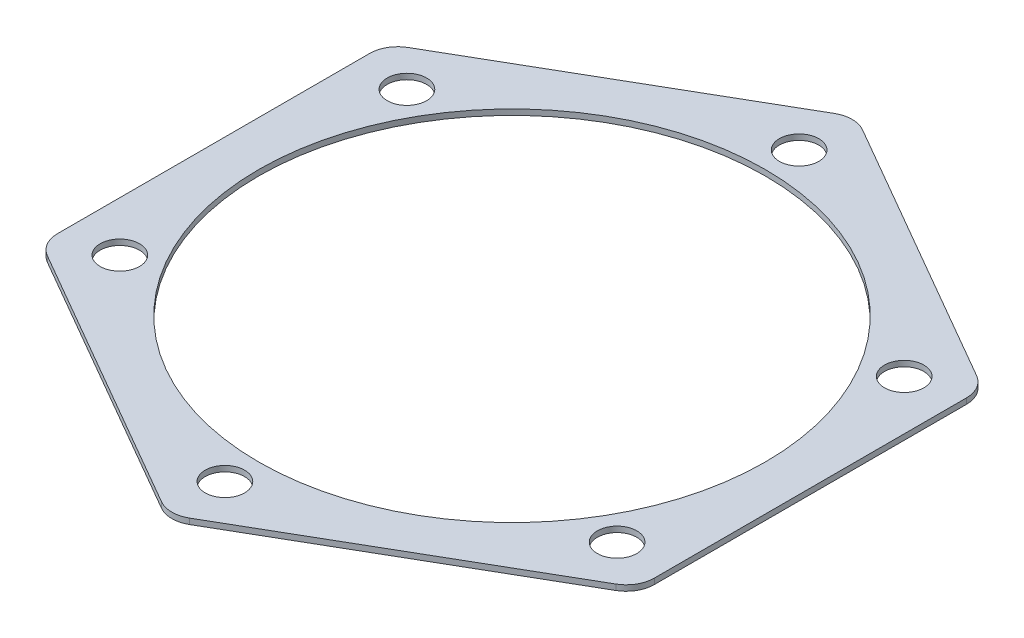
ISO-10303-21;
HEADER;
FILE_DESCRIPTION(('STEP AP214'),'2;1');
FILE_NAME('part.step','',(''),(''),'','','');
FILE_SCHEMA(('AUTOMOTIVE_DESIGN { 1 0 10303 214 1 1 1 1 }'));
ENDSEC;
DATA;
#1=APPLICATION_CONTEXT('core data for automotive mechanical design processes');
#2=APPLICATION_PROTOCOL_DEFINITION('international standard','automotive_design',2000,#1);
#3=PRODUCT_CONTEXT('',#1,'mechanical');
#4=PRODUCT('Part','Part','',(#3));
#5=PRODUCT_RELATED_PRODUCT_CATEGORY('part','',(#4));
#6=PRODUCT_DEFINITION_FORMATION('','',#4);
#7=PRODUCT_DEFINITION_CONTEXT('part definition',#1,'design');
#8=PRODUCT_DEFINITION('design','',#6,#7);
#9=PRODUCT_DEFINITION_SHAPE('','',#8);
#10=(LENGTH_UNIT() NAMED_UNIT(*) SI_UNIT(.MILLI.,.METRE.));
#11=(NAMED_UNIT(*) PLANE_ANGLE_UNIT() SI_UNIT($,.RADIAN.));
#12=(NAMED_UNIT(*) SI_UNIT($,.STERADIAN.) SOLID_ANGLE_UNIT());
#13=UNCERTAINTY_MEASURE_WITH_UNIT(LENGTH_MEASURE(1.E-05),#10,'distance_accuracy_value','');
#14=(GEOMETRIC_REPRESENTATION_CONTEXT(3) GLOBAL_UNCERTAINTY_ASSIGNED_CONTEXT((#13)) GLOBAL_UNIT_ASSIGNED_CONTEXT((#10,
#11,#12)) REPRESENTATION_CONTEXT('',''));
#15=CARTESIAN_POINT('',(0.,0.,0.));
#16=DIRECTION('',(0.,0.,1.));
#17=DIRECTION('',(1.,0.,0.));
#18=AXIS2_PLACEMENT_3D('',#15,#16,#17);
#19=CARTESIAN_POINT('',(-48.0000000000003,1.,-27.7128129211016));
#20=DIRECTION('',(0.,1.,0.));
#21=DIRECTION('',(0.,0.,1.));
#22=AXIS2_PLACEMENT_3D('',#19,#20,#21);
#23=PLANE('',#22);
#24=CARTESIAN_POINT('',(-44.1672955930031,1.,25.5000000000019));
#25=DIRECTION('',(0.,1.,0.));
#26=DIRECTION('',(0.,0.,1.));
#27=AXIS2_PLACEMENT_3D('',#24,#25,#26);
#28=CIRCLE('',#27,3.50000000000413);
#29=CARTESIAN_POINT('',(-44.1672955930031,1.,29.000000000006));
#30=VERTEX_POINT('',#29);
#31=EDGE_CURVE('E303',#30,#30,#28,.T.);
#32=ORIENTED_EDGE('',*,*,#31,.F.);
#33=EDGE_LOOP('',(#32));
#34=FACE_BOUND('',#33,.T.);
#35=CARTESIAN_POINT('',(44.1672955930096,1.,25.4999999999981));
#36=DIRECTION('',(0.,1.,0.));
#37=DIRECTION('',(0.,0.,1.));
#38=AXIS2_PLACEMENT_3D('',#35,#36,#37);
#39=CIRCLE('',#38,3.50000000000279);
#40=CARTESIAN_POINT('',(44.1672955930096,1.,29.0000000000009));
#41=VERTEX_POINT('',#40);
#42=EDGE_CURVE('E315',#41,#41,#39,.T.);
#43=ORIENTED_EDGE('',*,*,#42,.F.);
#44=EDGE_LOOP('',(#43));
#45=FACE_BOUND('',#44,.T.);
#46=CARTESIAN_POINT('',(0.,1.,-51.));
#47=DIRECTION('',(0.,1.,0.));
#48=DIRECTION('',(0.,0.,1.));
#49=AXIS2_PLACEMENT_3D('',#46,#47,#48);
#50=CIRCLE('',#49,3.5);
#51=CARTESIAN_POINT('',(0.,1.,-47.5));
#52=VERTEX_POINT('',#51);
#53=EDGE_CURVE('E327',#52,#52,#50,.T.);
#54=ORIENTED_EDGE('',*,*,#53,.F.);
#55=EDGE_LOOP('',(#54));
#56=FACE_BOUND('',#55,.T.);
#57=CARTESIAN_POINT('',(-48.0000000000003,1.,-27.7128129211016));
#58=DIRECTION('',(0.,1.,0.));
#59=DIRECTION('',(0.,0.,1.));
#60=AXIS2_PLACEMENT_3D('',#57,#58,#59);
#61=CIRCLE('',#60,5.);
#62=CARTESIAN_POINT('',(-50.5000000000003,1.,-32.0429399400238));
#63=VERTEX_POINT('',#62);
#64=CARTESIAN_POINT('',(-53.0000000000003,1.,-27.7128129211015));
#65=VERTEX_POINT('',#64);
#66=EDGE_CURVE('E177',#63,#65,#61,.T.);
#67=ORIENTED_EDGE('',*,*,#66,.T.);
#68=DIRECTION('',(0.,0.,1.));
#69=VECTOR('',#68,1.);
#70=CARTESIAN_POINT('',(-53.0000000000003,1.,-27.7128129211015));
#71=LINE('',#70,#69);
#72=CARTESIAN_POINT('',(-52.9999999999997,1.,27.7128129211027));
#73=VERTEX_POINT('',#72);
#74=EDGE_CURVE('E105',#65,#73,#71,.T.);
#75=ORIENTED_EDGE('',*,*,#74,.T.);
#76=CARTESIAN_POINT('',(-47.9999999999997,1.,27.7128129211026));
#77=DIRECTION('',(0.,1.,0.));
#78=DIRECTION('',(0.,0.,1.));
#79=AXIS2_PLACEMENT_3D('',#76,#77,#78);
#80=CIRCLE('',#79,5.);
#81=CARTESIAN_POINT('',(-50.4999999999997,1.,32.0429399400249));
#82=VERTEX_POINT('',#81);
#83=EDGE_CURVE('E204',#73,#82,#80,.T.);
#84=ORIENTED_EDGE('',*,*,#83,.T.);
#85=DIRECTION('',(0.866025403784442,0.,0.499999999999995));
#86=VECTOR('',#85,1.);
#87=CARTESIAN_POINT('',(-50.4999999999997,1.,32.0429399400249));
#88=LINE('',#87,#86);
#89=CARTESIAN_POINT('',(-2.50000000000002,1.,59.7557528611263));
#90=VERTEX_POINT('',#89);
#91=EDGE_CURVE('E223',#82,#90,#88,.T.);
#92=ORIENTED_EDGE('',*,*,#91,.T.);
#93=CARTESIAN_POINT('',(0.,1.,55.4256258422041));
#94=DIRECTION('',(0.,1.,0.));
#95=DIRECTION('',(0.,0.,-1.));
#96=AXIS2_PLACEMENT_3D('',#93,#94,#95);
#97=CIRCLE('',#96,5.);
#98=CARTESIAN_POINT('',(2.5,1.,59.7557528611263));
#99=VERTEX_POINT('',#98);
#100=EDGE_CURVE('E220',#90,#99,#97,.T.);
#101=ORIENTED_EDGE('',*,*,#100,.T.);
#102=DIRECTION('',(0.866025403784438,0.,-0.500000000000001));
#103=VECTOR('',#102,1.);
#104=CARTESIAN_POINT('',(2.5,1.,59.7557528611263));
#105=LINE('',#104,#103);
#106=CARTESIAN_POINT('',(50.5000000000001,1.,32.0429399400241));
#107=VERTEX_POINT('',#106);
#108=EDGE_CURVE('E222',#99,#107,#105,.T.);
#109=ORIENTED_EDGE('',*,*,#108,.T.);
#110=CARTESIAN_POINT('',(48.0000000000001,1.,27.7128129211019));
#111=DIRECTION('',(0.,1.,0.));
#112=DIRECTION('',(0.,0.,1.));
#113=AXIS2_PLACEMENT_3D('',#110,#111,#112);
#114=CIRCLE('',#113,5.);
#115=CARTESIAN_POINT('',(53.0000000000001,1.,27.7128129211019));
#116=VERTEX_POINT('',#115);
#117=EDGE_CURVE('E225',#107,#116,#114,.T.);
#118=ORIENTED_EDGE('',*,*,#117,.T.);
#119=DIRECTION('',(0.,0.,-1.));
#120=VECTOR('',#119,1.);
#121=CARTESIAN_POINT('',(53.0000000000001,1.,27.7128129211019));
#122=LINE('',#121,#120);
#123=CARTESIAN_POINT('',(52.9999999999999,1.,-27.7128129211023));
#124=VERTEX_POINT('',#123);
#125=EDGE_CURVE('E231',#116,#124,#122,.T.);
#126=ORIENTED_EDGE('',*,*,#125,.T.);
#127=CARTESIAN_POINT('',(47.9999999999999,1.,-27.7128129211023));
#128=DIRECTION('',(0.,1.,0.));
#129=DIRECTION('',(0.,0.,1.));
#130=AXIS2_PLACEMENT_3D('',#127,#128,#129);
#131=CIRCLE('',#130,5.);
#132=CARTESIAN_POINT('',(50.4999999999999,1.,-32.0429399400245));
#133=VERTEX_POINT('',#132);
#134=EDGE_CURVE('E136',#124,#133,#131,.T.);
#135=ORIENTED_EDGE('',*,*,#134,.T.);
#136=DIRECTION('',(-0.866025403784441,0.,-0.499999999999995));
#137=VECTOR('',#136,1.);
#138=CARTESIAN_POINT('',(50.4999999999999,1.,-32.0429399400245));
#139=LINE('',#138,#137);
#140=CARTESIAN_POINT('',(2.49999999999961,1.,-59.7557528611263));
#141=VERTEX_POINT('',#140);
#142=EDGE_CURVE('E130',#133,#141,#139,.T.);
#143=ORIENTED_EDGE('',*,*,#142,.T.);
#144=CARTESIAN_POINT('',(-3.87610001608621E-13,1.,-55.4256258422041));
#145=DIRECTION('',(0.,1.,0.));
#146=DIRECTION('',(0.,0.,1.));
#147=AXIS2_PLACEMENT_3D('',#144,#145,#146);
#148=CIRCLE('',#147,5.);
#149=CARTESIAN_POINT('',(-2.50000000000044,1.,-59.7557528611263));
#150=VERTEX_POINT('',#149);
#151=EDGE_CURVE('E134',#141,#150,#148,.T.);
#152=ORIENTED_EDGE('',*,*,#151,.T.);
#153=DIRECTION('',(-0.866025403784435,0.,0.500000000000007));
#154=VECTOR('',#153,1.);
#155=CARTESIAN_POINT('',(-2.50000000000044,1.,-59.7557528611263));
#156=LINE('',#155,#154);
#157=EDGE_CURVE('E50',#150,#63,#156,.T.);
#158=ORIENTED_EDGE('',*,*,#157,.T.);
#159=EDGE_LOOP('',(#67,#75,#84,#92,#101,#109,#118,#126,#135,#143,#152,#158));
#160=FACE_BOUND('',#159,.T.);
#161=CARTESIAN_POINT('',(0.,1.,0.));
#162=DIRECTION('',(0.,1.,0.));
#163=DIRECTION('',(0.,0.,1.));
#164=AXIS2_PLACEMENT_3D('',#161,#162,#163);
#165=CIRCLE('',#164,45.);
#166=CARTESIAN_POINT('',(0.,1.,45.));
#167=VERTEX_POINT('',#166);
#168=EDGE_CURVE('E158',#167,#167,#165,.T.);
#169=ORIENTED_EDGE('',*,*,#168,.F.);
#170=EDGE_LOOP('',(#169));
#171=FACE_BOUND('',#170,.T.);
#172=CARTESIAN_POINT('',(44.1672955930074,1.,-25.5000000000019));
#173=DIRECTION('',(0.,1.,0.));
#174=DIRECTION('',(0.,0.,1.));
#175=AXIS2_PLACEMENT_3D('',#172,#173,#174);
#176=CIRCLE('',#175,3.50000000000063);
#177=CARTESIAN_POINT('',(44.1672955930074,1.,-22.0000000000013));
#178=VERTEX_POINT('',#177);
#179=EDGE_CURVE('E321',#178,#178,#176,.T.);
#180=ORIENTED_EDGE('',*,*,#179,.F.);
#181=EDGE_LOOP('',(#180));
#182=FACE_BOUND('',#181,.T.);
#183=CARTESIAN_POINT('',(4.32978444682486E-12,1.,51.));
#184=DIRECTION('',(0.,1.,0.));
#185=DIRECTION('',(0.,0.,1.));
#186=AXIS2_PLACEMENT_3D('',#183,#184,#185);
#187=CIRCLE('',#186,3.50000000000448);
#188=CARTESIAN_POINT('',(4.32978444682486E-12,1.,54.5000000000045));
#189=VERTEX_POINT('',#188);
#190=EDGE_CURVE('E309',#189,#189,#187,.T.);
#191=ORIENTED_EDGE('',*,*,#190,.F.);
#192=EDGE_LOOP('',(#191));
#193=FACE_BOUND('',#192,.T.);
#194=CARTESIAN_POINT('',(-44.1672955930053,1.,-25.4999999999981));
#195=DIRECTION('',(0.,1.,0.));
#196=DIRECTION('',(0.,0.,1.));
#197=AXIS2_PLACEMENT_3D('',#194,#195,#196);
#198=CIRCLE('',#197,3.50000000000219);
#199=CARTESIAN_POINT('',(-44.1672955930053,1.,-21.9999999999959));
#200=VERTEX_POINT('',#199);
#201=EDGE_CURVE('E294',#200,#200,#198,.T.);
#202=ORIENTED_EDGE('',*,*,#201,.F.);
#203=EDGE_LOOP('',(#202));
#204=FACE_BOUND('',#203,.T.);
#205=ADVANCED_FACE('F33',(#34,#45,#56,#160,#171,#182,#193,#204),#23,.T.);
#206=CARTESIAN_POINT('',(-48.0000000000003,0.,-27.7128129211016));
#207=DIRECTION('',(0.,1.,0.));
#208=DIRECTION('',(0.,0.,1.));
#209=AXIS2_PLACEMENT_3D('',#206,#207,#208);
#210=PLANE('',#209);
#211=CARTESIAN_POINT('',(-48.0000000000003,0.,-27.7128129211016));
#212=DIRECTION('',(0.,1.,0.));
#213=DIRECTION('',(0.,0.,1.));
#214=AXIS2_PLACEMENT_3D('',#211,#212,#213);
#215=CIRCLE('',#214,5.);
#216=CARTESIAN_POINT('',(-50.5000000000003,0.,-32.0429399400238));
#217=VERTEX_POINT('',#216);
#218=CARTESIAN_POINT('',(-53.0000000000003,0.,-27.7128129211015));
#219=VERTEX_POINT('',#218);
#220=EDGE_CURVE('E154',#217,#219,#215,.T.);
#221=ORIENTED_EDGE('',*,*,#220,.F.);
#222=DIRECTION('',(-0.866025403784435,0.,0.500000000000007));
#223=VECTOR('',#222,1.);
#224=CARTESIAN_POINT('',(-2.50000000000044,0.,-59.7557528611263));
#225=LINE('',#224,#223);
#226=CARTESIAN_POINT('',(-2.50000000000044,0.,-59.7557528611263));
#227=VERTEX_POINT('',#226);
#228=EDGE_CURVE('E97',#227,#217,#225,.T.);
#229=ORIENTED_EDGE('',*,*,#228,.F.);
#230=CARTESIAN_POINT('',(-3.87610001608621E-13,0.,-55.4256258422041));
#231=DIRECTION('',(0.,1.,0.));
#232=DIRECTION('',(0.,0.,1.));
#233=AXIS2_PLACEMENT_3D('',#230,#231,#232);
#234=CIRCLE('',#233,5.);
#235=CARTESIAN_POINT('',(2.49999999999961,0.,-59.7557528611263));
#236=VERTEX_POINT('',#235);
#237=EDGE_CURVE('E91',#236,#227,#234,.T.);
#238=ORIENTED_EDGE('',*,*,#237,.F.);
#239=DIRECTION('',(-0.866025403784441,0.,-0.499999999999995));
#240=VECTOR('',#239,1.);
#241=CARTESIAN_POINT('',(50.4999999999999,0.,-32.0429399400245));
#242=LINE('',#241,#240);
#243=CARTESIAN_POINT('',(50.4999999999999,0.,-32.0429399400245));
#244=VERTEX_POINT('',#243);
#245=EDGE_CURVE('E144',#244,#236,#242,.T.);
#246=ORIENTED_EDGE('',*,*,#245,.F.);
#247=CARTESIAN_POINT('',(47.9999999999999,0.,-27.7128129211023));
#248=DIRECTION('',(0.,1.,0.));
#249=DIRECTION('',(0.,0.,1.));
#250=AXIS2_PLACEMENT_3D('',#247,#248,#249);
#251=CIRCLE('',#250,5.);
#252=CARTESIAN_POINT('',(52.9999999999999,0.,-27.7128129211023));
#253=VERTEX_POINT('',#252);
#254=EDGE_CURVE('E172',#253,#244,#251,.T.);
#255=ORIENTED_EDGE('',*,*,#254,.F.);
#256=DIRECTION('',(0.,0.,-1.));
#257=VECTOR('',#256,1.);
#258=CARTESIAN_POINT('',(53.0000000000001,0.,27.7128129211019));
#259=LINE('',#258,#257);
#260=CARTESIAN_POINT('',(53.0000000000001,0.,27.7128129211019));
#261=VERTEX_POINT('',#260);
#262=EDGE_CURVE('E170',#261,#253,#259,.T.);
#263=ORIENTED_EDGE('',*,*,#262,.F.);
#264=CARTESIAN_POINT('',(48.0000000000001,0.,27.7128129211019));
#265=DIRECTION('',(0.,1.,0.));
#266=DIRECTION('',(0.,0.,1.));
#267=AXIS2_PLACEMENT_3D('',#264,#265,#266);
#268=CIRCLE('',#267,5.);
#269=CARTESIAN_POINT('',(50.5000000000001,0.,32.0429399400241));
#270=VERTEX_POINT('',#269);
#271=EDGE_CURVE('E168',#270,#261,#268,.T.);
#272=ORIENTED_EDGE('',*,*,#271,.F.);
#273=DIRECTION('',(0.866025403784438,0.,-0.500000000000001));
#274=VECTOR('',#273,1.);
#275=CARTESIAN_POINT('',(2.5,0.,59.7557528611263));
#276=LINE('',#275,#274);
#277=CARTESIAN_POINT('',(2.5,0.,59.7557528611263));
#278=VERTEX_POINT('',#277);
#279=EDGE_CURVE('E166',#278,#270,#276,.T.);
#280=ORIENTED_EDGE('',*,*,#279,.F.);
#281=CARTESIAN_POINT('',(0.,0.,55.4256258422041));
#282=DIRECTION('',(0.,1.,0.));
#283=DIRECTION('',(0.,0.,-1.));
#284=AXIS2_PLACEMENT_3D('',#281,#282,#283);
#285=CIRCLE('',#284,5.);
#286=CARTESIAN_POINT('',(-2.50000000000002,0.,59.7557528611263));
#287=VERTEX_POINT('',#286);
#288=EDGE_CURVE('E164',#287,#278,#285,.T.);
#289=ORIENTED_EDGE('',*,*,#288,.F.);
#290=DIRECTION('',(0.866025403784442,0.,0.499999999999995));
#291=VECTOR('',#290,1.);
#292=CARTESIAN_POINT('',(-50.4999999999997,0.,32.0429399400249));
#293=LINE('',#292,#291);
#294=CARTESIAN_POINT('',(-50.4999999999997,0.,32.0429399400249));
#295=VERTEX_POINT('',#294);
#296=EDGE_CURVE('E162',#295,#287,#293,.T.);
#297=ORIENTED_EDGE('',*,*,#296,.F.);
#298=CARTESIAN_POINT('',(-47.9999999999997,0.,27.7128129211026));
#299=DIRECTION('',(0.,1.,0.));
#300=DIRECTION('',(0.,0.,1.));
#301=AXIS2_PLACEMENT_3D('',#298,#299,#300);
#302=CIRCLE('',#301,5.);
#303=CARTESIAN_POINT('',(-52.9999999999997,0.,27.7128129211027));
#304=VERTEX_POINT('',#303);
#305=EDGE_CURVE('E160',#304,#295,#302,.T.);
#306=ORIENTED_EDGE('',*,*,#305,.F.);
#307=DIRECTION('',(0.,0.,1.));
#308=VECTOR('',#307,1.);
#309=CARTESIAN_POINT('',(-53.0000000000003,0.,-27.7128129211015));
#310=LINE('',#309,#308);
#311=EDGE_CURVE('E157',#219,#304,#310,.T.);
#312=ORIENTED_EDGE('',*,*,#311,.F.);
#313=EDGE_LOOP('',(#221,#229,#238,#246,#255,#263,#272,#280,#289,#297,#306,#312));
#314=FACE_BOUND('',#313,.T.);
#315=CARTESIAN_POINT('',(0.,0.,0.));
#316=DIRECTION('',(0.,1.,0.));
#317=DIRECTION('',(0.,0.,1.));
#318=AXIS2_PLACEMENT_3D('',#315,#316,#317);
#319=CIRCLE('',#318,45.);
#320=CARTESIAN_POINT('',(0.,0.,45.));
#321=VERTEX_POINT('',#320);
#322=EDGE_CURVE('E330',#321,#321,#319,.T.);
#323=ORIENTED_EDGE('',*,*,#322,.T.);
#324=EDGE_LOOP('',(#323));
#325=FACE_BOUND('',#324,.T.);
#326=CARTESIAN_POINT('',(0.,0.,-51.));
#327=DIRECTION('',(0.,1.,0.));
#328=DIRECTION('',(0.,0.,1.));
#329=AXIS2_PLACEMENT_3D('',#326,#327,#328);
#330=CIRCLE('',#329,3.5);
#331=CARTESIAN_POINT('',(0.,0.,-47.5));
#332=VERTEX_POINT('',#331);
#333=EDGE_CURVE('E324',#332,#332,#330,.T.);
#334=ORIENTED_EDGE('',*,*,#333,.T.);
#335=EDGE_LOOP('',(#334));
#336=FACE_BOUND('',#335,.T.);
#337=CARTESIAN_POINT('',(44.1672955930074,0.,-25.5000000000019));
#338=DIRECTION('',(0.,1.,0.));
#339=DIRECTION('',(0.,0.,1.));
#340=AXIS2_PLACEMENT_3D('',#337,#338,#339);
#341=CIRCLE('',#340,3.50000000000063);
#342=CARTESIAN_POINT('',(44.1672955930074,0.,-22.0000000000013));
#343=VERTEX_POINT('',#342);
#344=EDGE_CURVE('E318',#343,#343,#341,.T.);
#345=ORIENTED_EDGE('',*,*,#344,.T.);
#346=EDGE_LOOP('',(#345));
#347=FACE_BOUND('',#346,.T.);
#348=CARTESIAN_POINT('',(44.1672955930096,0.,25.4999999999981));
#349=DIRECTION('',(0.,1.,0.));
#350=DIRECTION('',(0.,0.,1.));
#351=AXIS2_PLACEMENT_3D('',#348,#349,#350);
#352=CIRCLE('',#351,3.50000000000279);
#353=CARTESIAN_POINT('',(44.1672955930096,0.,29.0000000000009));
#354=VERTEX_POINT('',#353);
#355=EDGE_CURVE('E312',#354,#354,#352,.T.);
#356=ORIENTED_EDGE('',*,*,#355,.T.);
#357=EDGE_LOOP('',(#356));
#358=FACE_BOUND('',#357,.T.);
#359=CARTESIAN_POINT('',(4.32978444682486E-12,0.,51.));
#360=DIRECTION('',(0.,1.,0.));
#361=DIRECTION('',(0.,0.,1.));
#362=AXIS2_PLACEMENT_3D('',#359,#360,#361);
#363=CIRCLE('',#362,3.50000000000448);
#364=CARTESIAN_POINT('',(4.32978444682486E-12,0.,54.5000000000045));
#365=VERTEX_POINT('',#364);
#366=EDGE_CURVE('E306',#365,#365,#363,.T.);
#367=ORIENTED_EDGE('',*,*,#366,.T.);
#368=EDGE_LOOP('',(#367));
#369=FACE_BOUND('',#368,.T.);
#370=CARTESIAN_POINT('',(-44.1672955930031,0.,25.5000000000019));
#371=DIRECTION('',(0.,1.,0.));
#372=DIRECTION('',(0.,0.,1.));
#373=AXIS2_PLACEMENT_3D('',#370,#371,#372);
#374=CIRCLE('',#373,3.50000000000413);
#375=CARTESIAN_POINT('',(-44.1672955930031,0.,29.000000000006));
#376=VERTEX_POINT('',#375);
#377=EDGE_CURVE('E300',#376,#376,#374,.T.);
#378=ORIENTED_EDGE('',*,*,#377,.T.);
#379=EDGE_LOOP('',(#378));
#380=FACE_BOUND('',#379,.T.);
#381=CARTESIAN_POINT('',(-44.1672955930053,0.,-25.4999999999981));
#382=DIRECTION('',(0.,1.,0.));
#383=DIRECTION('',(0.,0.,1.));
#384=AXIS2_PLACEMENT_3D('',#381,#382,#383);
#385=CIRCLE('',#384,3.50000000000219);
#386=CARTESIAN_POINT('',(-44.1672955930053,0.,-21.9999999999959));
#387=VERTEX_POINT('',#386);
#388=EDGE_CURVE('E297',#387,#387,#385,.T.);
#389=ORIENTED_EDGE('',*,*,#388,.T.);
#390=EDGE_LOOP('',(#389));
#391=FACE_BOUND('',#390,.T.);
#392=ADVANCED_FACE('F208',(#314,#325,#336,#347,#358,#369,#380,#391),#210,.F.);
#393=CARTESIAN_POINT('',(-48.0000000000003,1.,-27.7128129211016));
#394=DIRECTION('',(0.,-1.,0.));
#395=DIRECTION('',(0.,0.,-1.));
#396=AXIS2_PLACEMENT_3D('',#393,#394,#395);
#397=CYLINDRICAL_SURFACE('',#396,5.);
#398=ORIENTED_EDGE('',*,*,#220,.T.);
#399=DIRECTION('',(0.,-1.,0.));
#400=VECTOR('',#399,1.);
#401=CARTESIAN_POINT('',(-53.0000000000003,1.,-27.7128129211015));
#402=LINE('',#401,#400);
#403=EDGE_CURVE('E11',#65,#219,#402,.T.);
#404=ORIENTED_EDGE('',*,*,#403,.F.);
#405=ORIENTED_EDGE('',*,*,#66,.F.);
#406=DIRECTION('',(0.,-1.,0.));
#407=VECTOR('',#406,1.);
#408=CARTESIAN_POINT('',(-50.5000000000003,1.,-32.0429399400238));
#409=LINE('',#408,#407);
#410=EDGE_CURVE('E150',#63,#217,#409,.T.);
#411=ORIENTED_EDGE('',*,*,#410,.T.);
#412=EDGE_LOOP('',(#398,#404,#405,#411));
#413=FACE_BOUND('',#412,.T.);
#414=ADVANCED_FACE('F35',(#413),#397,.T.);
#415=CARTESIAN_POINT('',(-53.0000000000003,1.,-27.7128129211015));
#416=DIRECTION('',(1.,0.,0.));
#417=DIRECTION('',(0.,0.,-1.));
#418=AXIS2_PLACEMENT_3D('',#415,#416,#417);
#419=PLANE('',#418);
#420=ORIENTED_EDGE('',*,*,#311,.T.);
#421=DIRECTION('',(0.,-1.,0.));
#422=VECTOR('',#421,1.);
#423=CARTESIAN_POINT('',(-52.9999999999997,1.,27.7128129211027));
#424=LINE('',#423,#422);
#425=EDGE_CURVE('E42',#73,#304,#424,.T.);
#426=ORIENTED_EDGE('',*,*,#425,.F.);
#427=ORIENTED_EDGE('',*,*,#74,.F.);
#428=ORIENTED_EDGE('',*,*,#403,.T.);
#429=EDGE_LOOP('',(#420,#426,#427,#428));
#430=FACE_BOUND('',#429,.T.);
#431=ADVANCED_FACE('F467',(#430),#419,.F.);
#432=CARTESIAN_POINT('',(-47.9999999999997,1.,27.7128129211026));
#433=DIRECTION('',(0.,-1.,0.));
#434=DIRECTION('',(0.,0.,-1.));
#435=AXIS2_PLACEMENT_3D('',#432,#433,#434);
#436=CYLINDRICAL_SURFACE('',#435,5.);
#437=ORIENTED_EDGE('',*,*,#305,.T.);
#438=DIRECTION('',(0.,-1.,0.));
#439=VECTOR('',#438,1.);
#440=CARTESIAN_POINT('',(-50.4999999999997,1.,32.0429399400249));
#441=LINE('',#440,#439);
#442=EDGE_CURVE('E196',#82,#295,#441,.T.);
#443=ORIENTED_EDGE('',*,*,#442,.F.);
#444=ORIENTED_EDGE('',*,*,#83,.F.);
#445=ORIENTED_EDGE('',*,*,#425,.T.);
#446=EDGE_LOOP('',(#437,#443,#444,#445));
#447=FACE_BOUND('',#446,.T.);
#448=ADVANCED_FACE('F202',(#447),#436,.T.);
#449=CARTESIAN_POINT('',(-50.4999999999997,1.,32.0429399400249));
#450=DIRECTION('',(0.499999999999995,0.,-0.866025403784442));
#451=DIRECTION('',(-0.866025403784442,0.,-0.499999999999995));
#452=AXIS2_PLACEMENT_3D('',#449,#450,#451);
#453=PLANE('',#452);
#454=ORIENTED_EDGE('',*,*,#296,.T.);
#455=DIRECTION('',(0.,-1.,0.));
#456=VECTOR('',#455,1.);
#457=CARTESIAN_POINT('',(-2.50000000000002,1.,59.7557528611263));
#458=LINE('',#457,#456);
#459=EDGE_CURVE('E193',#90,#287,#458,.T.);
#460=ORIENTED_EDGE('',*,*,#459,.F.);
#461=ORIENTED_EDGE('',*,*,#91,.F.);
#462=ORIENTED_EDGE('',*,*,#442,.T.);
#463=EDGE_LOOP('',(#454,#460,#461,#462));
#464=FACE_BOUND('',#463,.T.);
#465=ADVANCED_FACE('F214',(#464),#453,.F.);
#466=CARTESIAN_POINT('',(0.,1.,55.4256258422041));
#467=DIRECTION('',(0.,-1.,0.));
#468=DIRECTION('',(0.,0.,-1.));
#469=AXIS2_PLACEMENT_3D('',#466,#467,#468);
#470=CYLINDRICAL_SURFACE('',#469,5.);
#471=ORIENTED_EDGE('',*,*,#288,.T.);
#472=DIRECTION('',(0.,-1.,0.));
#473=VECTOR('',#472,1.);
#474=CARTESIAN_POINT('',(2.5,1.,59.7557528611263));
#475=LINE('',#474,#473);
#476=EDGE_CURVE('E190',#99,#278,#475,.T.);
#477=ORIENTED_EDGE('',*,*,#476,.F.);
#478=ORIENTED_EDGE('',*,*,#100,.F.);
#479=ORIENTED_EDGE('',*,*,#459,.T.);
#480=EDGE_LOOP('',(#471,#477,#478,#479));
#481=FACE_BOUND('',#480,.T.);
#482=ADVANCED_FACE('F218',(#481),#470,.T.);
#483=CARTESIAN_POINT('',(2.5,1.,59.7557528611263));
#484=DIRECTION('',(-0.500000000000001,0.,-0.866025403784438));
#485=DIRECTION('',(-0.866025403784438,0.,0.500000000000001));
#486=AXIS2_PLACEMENT_3D('',#483,#484,#485);
#487=PLANE('',#486);
#488=ORIENTED_EDGE('',*,*,#279,.T.);
#489=DIRECTION('',(0.,-1.,0.));
#490=VECTOR('',#489,1.);
#491=CARTESIAN_POINT('',(50.5000000000001,1.,32.0429399400241));
#492=LINE('',#491,#490);
#493=EDGE_CURVE('E187',#107,#270,#492,.T.);
#494=ORIENTED_EDGE('',*,*,#493,.F.);
#495=ORIENTED_EDGE('',*,*,#108,.F.);
#496=ORIENTED_EDGE('',*,*,#476,.T.);
#497=EDGE_LOOP('',(#488,#494,#495,#496));
#498=FACE_BOUND('',#497,.T.);
#499=ADVANCED_FACE('F432',(#498),#487,.F.);
#500=CARTESIAN_POINT('',(48.0000000000001,1.,27.7128129211019));
#501=DIRECTION('',(0.,-1.,0.));
#502=DIRECTION('',(0.,0.,-1.));
#503=AXIS2_PLACEMENT_3D('',#500,#501,#502);
#504=CYLINDRICAL_SURFACE('',#503,5.);
#505=ORIENTED_EDGE('',*,*,#271,.T.);
#506=DIRECTION('',(0.,-1.,0.));
#507=VECTOR('',#506,1.);
#508=CARTESIAN_POINT('',(53.0000000000001,1.,27.7128129211019));
#509=LINE('',#508,#507);
#510=EDGE_CURVE('E184',#116,#261,#509,.T.);
#511=ORIENTED_EDGE('',*,*,#510,.F.);
#512=ORIENTED_EDGE('',*,*,#117,.F.);
#513=ORIENTED_EDGE('',*,*,#493,.T.);
#514=EDGE_LOOP('',(#505,#511,#512,#513));
#515=FACE_BOUND('',#514,.T.);
#516=ADVANCED_FACE('F423',(#515),#504,.T.);
#517=CARTESIAN_POINT('',(53.0000000000001,1.,27.7128129211019));
#518=DIRECTION('',(-1.,0.,0.));
#519=DIRECTION('',(0.,0.,1.));
#520=AXIS2_PLACEMENT_3D('',#517,#518,#519);
#521=PLANE('',#520);
#522=ORIENTED_EDGE('',*,*,#262,.T.);
#523=DIRECTION('',(0.,-1.,0.));
#524=VECTOR('',#523,1.);
#525=CARTESIAN_POINT('',(52.9999999999999,1.,-27.7128129211023));
#526=LINE('',#525,#524);
#527=EDGE_CURVE('E181',#124,#253,#526,.T.);
#528=ORIENTED_EDGE('',*,*,#527,.F.);
#529=ORIENTED_EDGE('',*,*,#125,.F.);
#530=ORIENTED_EDGE('',*,*,#510,.T.);
#531=EDGE_LOOP('',(#522,#528,#529,#530));
#532=FACE_BOUND('',#531,.T.);
#533=ADVANCED_FACE('F237',(#532),#521,.F.);
#534=CARTESIAN_POINT('',(47.9999999999999,1.,-27.7128129211023));
#535=DIRECTION('',(0.,-1.,0.));
#536=DIRECTION('',(0.,0.,-1.));
#537=AXIS2_PLACEMENT_3D('',#534,#535,#536);
#538=CYLINDRICAL_SURFACE('',#537,5.);
#539=ORIENTED_EDGE('',*,*,#254,.T.);
#540=DIRECTION('',(0.,-1.,0.));
#541=VECTOR('',#540,1.);
#542=CARTESIAN_POINT('',(50.4999999999999,1.,-32.0429399400245));
#543=LINE('',#542,#541);
#544=EDGE_CURVE('E145',#133,#244,#543,.T.);
#545=ORIENTED_EDGE('',*,*,#544,.F.);
#546=ORIENTED_EDGE('',*,*,#134,.F.);
#547=ORIENTED_EDGE('',*,*,#527,.T.);
#548=EDGE_LOOP('',(#539,#545,#546,#547));
#549=FACE_BOUND('',#548,.T.);
#550=ADVANCED_FACE('F241',(#549),#538,.T.);
#551=CARTESIAN_POINT('',(50.4999999999999,1.,-32.0429399400245));
#552=DIRECTION('',(-0.499999999999995,0.,0.866025403784442));
#553=DIRECTION('',(0.866025403784442,0.,0.499999999999995));
#554=AXIS2_PLACEMENT_3D('',#551,#552,#553);
#555=PLANE('',#554);
#556=ORIENTED_EDGE('',*,*,#245,.T.);
#557=DIRECTION('',(0.,-1.,0.));
#558=VECTOR('',#557,1.);
#559=CARTESIAN_POINT('',(2.49999999999961,1.,-59.7557528611263));
#560=LINE('',#559,#558);
#561=EDGE_CURVE('E141',#141,#236,#560,.T.);
#562=ORIENTED_EDGE('',*,*,#561,.F.);
#563=ORIENTED_EDGE('',*,*,#142,.F.);
#564=ORIENTED_EDGE('',*,*,#544,.T.);
#565=EDGE_LOOP('',(#556,#562,#563,#564));
#566=FACE_BOUND('',#565,.T.);
#567=ADVANCED_FACE('F142',(#566),#555,.F.);
#568=CARTESIAN_POINT('',(-3.87610001608621E-13,1.,-55.4256258422041));
#569=DIRECTION('',(0.,-1.,0.));
#570=DIRECTION('',(0.,0.,-1.));
#571=AXIS2_PLACEMENT_3D('',#568,#569,#570);
#572=CYLINDRICAL_SURFACE('',#571,5.);
#573=ORIENTED_EDGE('',*,*,#237,.T.);
#574=DIRECTION('',(0.,-1.,0.));
#575=VECTOR('',#574,1.);
#576=CARTESIAN_POINT('',(-2.50000000000044,1.,-59.7557528611263));
#577=LINE('',#576,#575);
#578=EDGE_CURVE('E146',#150,#227,#577,.T.);
#579=ORIENTED_EDGE('',*,*,#578,.F.);
#580=ORIENTED_EDGE('',*,*,#151,.F.);
#581=ORIENTED_EDGE('',*,*,#561,.T.);
#582=EDGE_LOOP('',(#573,#579,#580,#581));
#583=FACE_BOUND('',#582,.T.);
#584=ADVANCED_FACE('F148',(#583),#572,.T.);
#585=CARTESIAN_POINT('',(-2.50000000000044,1.,-59.7557528611263));
#586=DIRECTION('',(0.500000000000007,0.,0.866025403784435));
#587=DIRECTION('',(0.866025403784435,0.,-0.500000000000007));
#588=AXIS2_PLACEMENT_3D('',#585,#586,#587);
#589=PLANE('',#588);
#590=ORIENTED_EDGE('',*,*,#228,.T.);
#591=ORIENTED_EDGE('',*,*,#410,.F.);
#592=ORIENTED_EDGE('',*,*,#157,.F.);
#593=ORIENTED_EDGE('',*,*,#578,.T.);
#594=EDGE_LOOP('',(#590,#591,#592,#593));
#595=FACE_BOUND('',#594,.T.);
#596=ADVANCED_FACE('F245',(#595),#589,.F.);
#597=CARTESIAN_POINT('',(0.,1.,0.));
#598=DIRECTION('',(0.,-1.,0.));
#599=DIRECTION('',(0.,0.,-1.));
#600=AXIS2_PLACEMENT_3D('',#597,#598,#599);
#601=CYLINDRICAL_SURFACE('',#600,45.);
#602=ORIENTED_EDGE('',*,*,#168,.T.);
#603=EDGE_LOOP('',(#602));
#604=FACE_BOUND('',#603,.T.);
#605=ORIENTED_EDGE('',*,*,#322,.F.);
#606=EDGE_LOOP('',(#605));
#607=FACE_BOUND('',#606,.T.);
#608=ADVANCED_FACE('F247',(#604,#607),#601,.F.);
#609=CARTESIAN_POINT('',(0.,1.,-51.));
#610=DIRECTION('',(0.,-1.,0.));
#611=DIRECTION('',(0.,0.,-1.));
#612=AXIS2_PLACEMENT_3D('',#609,#610,#611);
#613=CYLINDRICAL_SURFACE('',#612,3.5);
#614=ORIENTED_EDGE('',*,*,#53,.T.);
#615=EDGE_LOOP('',(#614));
#616=FACE_BOUND('',#615,.T.);
#617=ORIENTED_EDGE('',*,*,#333,.F.);
#618=EDGE_LOOP('',(#617));
#619=FACE_BOUND('',#618,.T.);
#620=ADVANCED_FACE('F253',(#616,#619),#613,.F.);
#621=CARTESIAN_POINT('',(44.1672955930074,1.,-25.5000000000019));
#622=DIRECTION('',(0.,-1.,0.));
#623=DIRECTION('',(0.,0.,-1.));
#624=AXIS2_PLACEMENT_3D('',#621,#622,#623);
#625=CYLINDRICAL_SURFACE('',#624,3.50000000000063);
#626=ORIENTED_EDGE('',*,*,#179,.T.);
#627=EDGE_LOOP('',(#626));
#628=FACE_BOUND('',#627,.T.);
#629=ORIENTED_EDGE('',*,*,#344,.F.);
#630=EDGE_LOOP('',(#629));
#631=FACE_BOUND('',#630,.T.);
#632=ADVANCED_FACE('F269',(#628,#631),#625,.F.);
#633=CARTESIAN_POINT('',(44.1672955930096,1.,25.4999999999981));
#634=DIRECTION('',(0.,-1.,0.));
#635=DIRECTION('',(0.,0.,-1.));
#636=AXIS2_PLACEMENT_3D('',#633,#634,#635);
#637=CYLINDRICAL_SURFACE('',#636,3.50000000000279);
#638=ORIENTED_EDGE('',*,*,#42,.T.);
#639=EDGE_LOOP('',(#638));
#640=FACE_BOUND('',#639,.T.);
#641=ORIENTED_EDGE('',*,*,#355,.F.);
#642=EDGE_LOOP('',(#641));
#643=FACE_BOUND('',#642,.T.);
#644=ADVANCED_FACE('F273',(#640,#643),#637,.F.);
#645=CARTESIAN_POINT('',(4.32978444682486E-12,1.,51.));
#646=DIRECTION('',(0.,-1.,0.));
#647=DIRECTION('',(0.,0.,-1.));
#648=AXIS2_PLACEMENT_3D('',#645,#646,#647);
#649=CYLINDRICAL_SURFACE('',#648,3.50000000000448);
#650=ORIENTED_EDGE('',*,*,#190,.T.);
#651=EDGE_LOOP('',(#650));
#652=FACE_BOUND('',#651,.T.);
#653=ORIENTED_EDGE('',*,*,#366,.F.);
#654=EDGE_LOOP('',(#653));
#655=FACE_BOUND('',#654,.T.);
#656=ADVANCED_FACE('F277',(#652,#655),#649,.F.);
#657=CARTESIAN_POINT('',(-44.1672955930031,1.,25.5000000000019));
#658=DIRECTION('',(0.,-1.,0.));
#659=DIRECTION('',(0.,0.,-1.));
#660=AXIS2_PLACEMENT_3D('',#657,#658,#659);
#661=CYLINDRICAL_SURFACE('',#660,3.50000000000413);
#662=ORIENTED_EDGE('',*,*,#31,.T.);
#663=EDGE_LOOP('',(#662));
#664=FACE_BOUND('',#663,.T.);
#665=ORIENTED_EDGE('',*,*,#377,.F.);
#666=EDGE_LOOP('',(#665));
#667=FACE_BOUND('',#666,.T.);
#668=ADVANCED_FACE('F281',(#664,#667),#661,.F.);
#669=CARTESIAN_POINT('',(-44.1672955930053,1.,-25.4999999999981));
#670=DIRECTION('',(0.,-1.,0.));
#671=DIRECTION('',(0.,0.,-1.));
#672=AXIS2_PLACEMENT_3D('',#669,#670,#671);
#673=CYLINDRICAL_SURFACE('',#672,3.50000000000219);
#674=ORIENTED_EDGE('',*,*,#201,.T.);
#675=EDGE_LOOP('',(#674));
#676=FACE_BOUND('',#675,.T.);
#677=ORIENTED_EDGE('',*,*,#388,.F.);
#678=EDGE_LOOP('',(#677));
#679=FACE_BOUND('',#678,.T.);
#680=ADVANCED_FACE('F285',(#676,#679),#673,.F.);
#681=CLOSED_SHELL('',(#205,#392,#414,#431,#448,#465,#482,#499,#516,#533,#550,#567,#584,#596,
#608,#620,#632,#644,#656,#668,#680));
#682=MANIFOLD_SOLID_BREP('B2',#681);
#683=ADVANCED_BREP_SHAPE_REPRESENTATION('',(#18,#682),#14);
#684=SHAPE_DEFINITION_REPRESENTATION(#9,#683);
ENDSEC;
END-ISO-10303-21;
